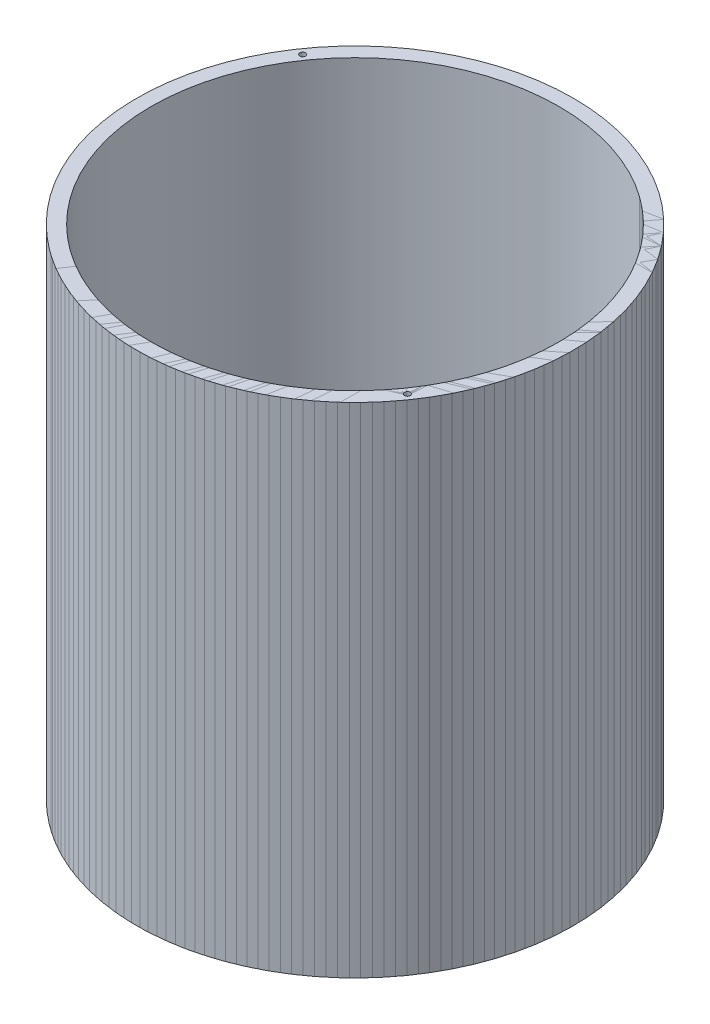
ISO-10303-21;
HEADER;
FILE_DESCRIPTION(('STEP AP214'),'2;1');
FILE_NAME('part.step','',(''),(''),'','','');
FILE_SCHEMA(('AUTOMOTIVE_DESIGN { 1 0 10303 214 1 1 1 1 }'));
ENDSEC;
DATA;
#1=APPLICATION_CONTEXT('core data for automotive mechanical design processes');
#2=APPLICATION_PROTOCOL_DEFINITION('international standard','automotive_design',2000,#1);
#3=PRODUCT_CONTEXT('',#1,'mechanical');
#4=PRODUCT('Part','Part','',(#3));
#5=PRODUCT_RELATED_PRODUCT_CATEGORY('part','',(#4));
#6=PRODUCT_DEFINITION_FORMATION('','',#4);
#7=PRODUCT_DEFINITION_CONTEXT('part definition',#1,'design');
#8=PRODUCT_DEFINITION('design','',#6,#7);
#9=PRODUCT_DEFINITION_SHAPE('','',#8);
#10=(LENGTH_UNIT() NAMED_UNIT(*) SI_UNIT(.MILLI.,.METRE.));
#11=(NAMED_UNIT(*) PLANE_ANGLE_UNIT() SI_UNIT($,.RADIAN.));
#12=(NAMED_UNIT(*) SI_UNIT($,.STERADIAN.) SOLID_ANGLE_UNIT());
#13=UNCERTAINTY_MEASURE_WITH_UNIT(LENGTH_MEASURE(1.E-05),#10,'distance_accuracy_value','');
#14=(GEOMETRIC_REPRESENTATION_CONTEXT(3) GLOBAL_UNCERTAINTY_ASSIGNED_CONTEXT((#13)) GLOBAL_UNIT_ASSIGNED_CONTEXT((#10,
#11,#12)) REPRESENTATION_CONTEXT('',''));
#15=CARTESIAN_POINT('',(0.,0.,0.));
#16=DIRECTION('',(0.,0.,1.));
#17=DIRECTION('',(1.,0.,0.));
#18=AXIS2_PLACEMENT_3D('',#15,#16,#17);
#19=CARTESIAN_POINT('',(193.392189054267,324.789542194984,841.433816930312));
#20=DIRECTION('',(0.,-1.,0.));
#21=DIRECTION('',(0.,0.,-1.));
#22=AXIS2_PLACEMENT_3D('',#19,#20,#21);
#23=CYLINDRICAL_SURFACE('',#22,71.);
#24=DIRECTION('',(0.,-1.,0.));
#25=VECTOR('',#24,1.);
#26=CARTESIAN_POINT('',(234.008163536553,324.789542194984,783.198581747011));
#27=LINE('',#26,#25);
#28=CARTESIAN_POINT('',(234.008163536553,151.289542194984,783.198581747011));
#29=VERTEX_POINT('',#28);
#30=CARTESIAN_POINT('',(234.008163536553,324.789542194984,783.198581747011));
#31=VERTEX_POINT('',#30);
#32=EDGE_CURVE('E83',#29,#31,#27,.F.);
#33=ORIENTED_EDGE('',*,*,#32,.F.);
#34=CARTESIAN_POINT('',(193.392189054267,151.289542194984,841.433816930312));
#35=DIRECTION('',(0.,-1.,0.));
#36=DIRECTION('',(0.,0.,-1.));
#37=AXIS2_PLACEMENT_3D('',#34,#35,#36);
#38=CIRCLE('',#37,71.);
#39=CARTESIAN_POINT('',(152.776214571982,151.289542194984,899.669052113613));
#40=VERTEX_POINT('',#39);
#41=EDGE_CURVE('E93',#29,#40,#38,.T.);
#42=ORIENTED_EDGE('',*,*,#41,.T.);
#43=DIRECTION('',(0.,-1.,0.));
#44=VECTOR('',#43,1.);
#45=CARTESIAN_POINT('',(152.776214571982,324.789542194984,899.669052113613));
#46=LINE('',#45,#44);
#47=CARTESIAN_POINT('',(152.776214571982,324.789542194984,899.669052113613));
#48=VERTEX_POINT('',#47);
#49=EDGE_CURVE('E67',#48,#40,#46,.T.);
#50=ORIENTED_EDGE('',*,*,#49,.F.);
#51=CARTESIAN_POINT('',(193.392189054267,324.789542194984,841.433816930312));
#52=DIRECTION('',(0.,-1.,0.));
#53=DIRECTION('',(0.,0.,-1.));
#54=AXIS2_PLACEMENT_3D('',#51,#52,#53);
#55=CIRCLE('',#54,71.);
#56=EDGE_CURVE('E95',#31,#48,#55,.T.);
#57=ORIENTED_EDGE('',*,*,#56,.F.);
#58=EDGE_LOOP('',(#33,#42,#50,#57));
#59=FACE_BOUND('',#58,.T.);
#60=ADVANCED_FACE('F45',(#59),#23,.F.);
#61=CARTESIAN_POINT('',(193.392189054267,324.789542194984,841.433816930312));
#62=DIRECTION('',(0.,-1.,0.));
#63=DIRECTION('',(0.,0.,-1.));
#64=AXIS2_PLACEMENT_3D('',#61,#62,#63);
#65=CYLINDRICAL_SURFACE('',#64,76.);
#66=CARTESIAN_POINT('',(193.392189054267,151.289542194984,841.433816930312));
#67=DIRECTION('',(0.,-1.,0.));
#68=DIRECTION('',(0.,0.,-1.));
#69=AXIS2_PLACEMENT_3D('',#66,#67,#68);
#70=CIRCLE('',#69,76.);
#71=CARTESIAN_POINT('',(236.868443429672,151.289542194984,779.097508846779));
#72=VERTEX_POINT('',#71);
#73=CARTESIAN_POINT('',(149.915934678864,151.289542194984,903.770125013846));
#74=VERTEX_POINT('',#73);
#75=EDGE_CURVE('E103',#72,#74,#70,.T.);
#76=ORIENTED_EDGE('',*,*,#75,.F.);
#77=DIRECTION('',(0.,-1.,0.));
#78=VECTOR('',#77,1.);
#79=CARTESIAN_POINT('',(236.868443429672,324.789542194984,779.097508846779));
#80=LINE('',#79,#78);
#81=CARTESIAN_POINT('',(236.868443429672,324.789542194984,779.097508846779));
#82=VERTEX_POINT('',#81);
#83=EDGE_CURVE('E59',#72,#82,#80,.F.);
#84=ORIENTED_EDGE('',*,*,#83,.T.);
#85=CARTESIAN_POINT('',(193.392189054267,324.789542194984,841.433816930312));
#86=DIRECTION('',(0.,-1.,0.));
#87=DIRECTION('',(0.,0.,-1.));
#88=AXIS2_PLACEMENT_3D('',#85,#86,#87);
#89=CIRCLE('',#88,76.);
#90=CARTESIAN_POINT('',(149.915934678864,324.789542194984,903.770125013846));
#91=VERTEX_POINT('',#90);
#92=EDGE_CURVE('E89',#82,#91,#89,.T.);
#93=ORIENTED_EDGE('',*,*,#92,.T.);
#94=DIRECTION('',(0.,-1.,0.));
#95=VECTOR('',#94,1.);
#96=CARTESIAN_POINT('',(149.915934678864,324.789542194984,903.770125013846));
#97=LINE('',#96,#95);
#98=EDGE_CURVE('E115',#91,#74,#97,.T.);
#99=ORIENTED_EDGE('',*,*,#98,.T.);
#100=EDGE_LOOP('',(#76,#84,#93,#99));
#101=FACE_BOUND('',#100,.T.);
#102=ADVANCED_FACE('F121',(#101),#65,.T.);
#103=CARTESIAN_POINT('',(0.,324.789542194984,0.));
#104=DIRECTION('',(0.,-1.,0.));
#105=DIRECTION('',(0.,0.,-1.));
#106=AXIS2_PLACEMENT_3D('',#103,#104,#105);
#107=PLANE('',#106);
#108=CARTESIAN_POINT('',(253.677960687685,324.789542194984,883.479931359157));
#109=DIRECTION('',(0.,-1.,0.));
#110=DIRECTION('',(0.,0.,-1.));
#111=AXIS2_PLACEMENT_3D('',#108,#109,#110);
#112=CIRCLE('',#111,0.999999999999998);
#113=CARTESIAN_POINT('',(253.677960687685,324.789542194984,882.479931359157));
#114=VERTEX_POINT('',#113);
#115=EDGE_CURVE('E108',#114,#114,#112,.T.);
#116=ORIENTED_EDGE('',*,*,#115,.T.);
#117=EDGE_LOOP('',(#116));
#118=FACE_BOUND('',#117,.T.);
#119=DIRECTION('',(0.572055978623735,0.,-0.820214580046491));
#120=VECTOR('',#119,1.);
#121=CARTESIAN_POINT('',(524.913002615921,324.789542194984,366.098858406972));
#122=LINE('',#121,#120);
#123=EDGE_CURVE('E100',#91,#48,#122,.T.);
#124=ORIENTED_EDGE('',*,*,#123,.F.);
#125=ORIENTED_EDGE('',*,*,#92,.F.);
#126=EDGE_CURVE('E96',#31,#82,#122,.T.);
#127=ORIENTED_EDGE('',*,*,#126,.F.);
#128=ORIENTED_EDGE('',*,*,#56,.T.);
#129=EDGE_LOOP('',(#124,#125,#127,#128));
#130=FACE_BOUND('',#129,.T.);
#131=ADVANCED_FACE('F122',(#118,#130),#107,.F.);
#132=CARTESIAN_POINT('',(0.,151.289542194984,0.));
#133=DIRECTION('',(0.,-1.,0.));
#134=DIRECTION('',(0.,0.,-1.));
#135=AXIS2_PLACEMENT_3D('',#132,#133,#134);
#136=PLANE('',#135);
#137=CARTESIAN_POINT('',(253.677960687685,151.289542194984,883.479931359157));
#138=DIRECTION('',(0.,-1.,0.));
#139=DIRECTION('',(0.,0.,-1.));
#140=AXIS2_PLACEMENT_3D('',#137,#138,#139);
#141=CIRCLE('',#140,0.999999999999998);
#142=CARTESIAN_POINT('',(253.677960687685,151.289542194984,882.479931359157));
#143=VERTEX_POINT('',#142);
#144=EDGE_CURVE('E99',#143,#143,#141,.T.);
#145=ORIENTED_EDGE('',*,*,#144,.F.);
#146=EDGE_LOOP('',(#145));
#147=FACE_BOUND('',#146,.T.);
#148=ORIENTED_EDGE('',*,*,#75,.T.);
#149=DIRECTION('',(0.572055978623735,0.,-0.820214580046491));
#150=VECTOR('',#149,1.);
#151=CARTESIAN_POINT('',(524.913002615921,151.289542194984,366.098858406972));
#152=LINE('',#151,#150);
#153=EDGE_CURVE('E12',#74,#40,#152,.T.);
#154=ORIENTED_EDGE('',*,*,#153,.T.);
#155=ORIENTED_EDGE('',*,*,#41,.F.);
#156=EDGE_CURVE('E48',#29,#72,#152,.T.);
#157=ORIENTED_EDGE('',*,*,#156,.T.);
#158=EDGE_LOOP('',(#148,#154,#155,#157));
#159=FACE_BOUND('',#158,.T.);
#160=ADVANCED_FACE('F98',(#147,#159),#136,.T.);
#161=CARTESIAN_POINT('',(253.677960687685,324.789542194984,883.479931359157));
#162=DIRECTION('',(0.,-1.,0.));
#163=DIRECTION('',(0.,0.,-1.));
#164=AXIS2_PLACEMENT_3D('',#161,#162,#163);
#165=CYLINDRICAL_SURFACE('',#164,0.999999999999998);
#166=ORIENTED_EDGE('',*,*,#115,.F.);
#167=EDGE_LOOP('',(#166));
#168=FACE_BOUND('',#167,.T.);
#169=ORIENTED_EDGE('',*,*,#144,.T.);
#170=EDGE_LOOP('',(#169));
#171=FACE_BOUND('',#170,.T.);
#172=ADVANCED_FACE('F129',(#168,#171),#165,.F.);
#173=CARTESIAN_POINT('',(524.913002615921,0.,366.098858406972));
#174=DIRECTION('',(-0.820214580046491,0.,-0.572055978623735));
#175=DIRECTION('',(-0.572055978623735,0.,0.820214580046491));
#176=AXIS2_PLACEMENT_3D('',#173,#174,#175);
#177=PLANE('',#176);
#178=ORIENTED_EDGE('',*,*,#126,.T.);
#179=ORIENTED_EDGE('',*,*,#83,.F.);
#180=ORIENTED_EDGE('',*,*,#156,.F.);
#181=ORIENTED_EDGE('',*,*,#32,.T.);
#182=EDGE_LOOP('',(#178,#179,#180,#181));
#183=FACE_BOUND('',#182,.T.);
#184=ADVANCED_FACE('F82',(#183),#177,.T.);
#185=ORIENTED_EDGE('',*,*,#123,.T.);
#186=ORIENTED_EDGE('',*,*,#49,.T.);
#187=ORIENTED_EDGE('',*,*,#153,.F.);
#188=ORIENTED_EDGE('',*,*,#98,.F.);
#189=EDGE_LOOP('',(#185,#186,#187,#188));
#190=FACE_BOUND('',#189,.T.);
#191=ADVANCED_FACE('F123',(#190),#177,.T.);
#192=CLOSED_SHELL('',(#60,#102,#131,#160,#172,#184,#191));
#193=MANIFOLD_SOLID_BREP('B2',#192);
#194=CARTESIAN_POINT('',(253.677960687685,324.789542194984,883.479931359157));
#195=DIRECTION('',(0.,-1.,0.));
#196=DIRECTION('',(0.,0.,-1.));
#197=AXIS2_PLACEMENT_3D('',#194,#195,#196);
#198=CYLINDRICAL_SURFACE('',#197,0.999999999999998);
#199=CARTESIAN_POINT('',(253.677960687685,324.789542194984,883.479931359157));
#200=DIRECTION('',(0.,-1.,0.));
#201=DIRECTION('',(0.,0.,-1.));
#202=AXIS2_PLACEMENT_3D('',#199,#200,#201);
#203=CIRCLE('',#202,0.999999999999998);
#204=CARTESIAN_POINT('',(253.677960687685,324.789542194984,882.479931359157));
#205=VERTEX_POINT('',#204);
#206=EDGE_CURVE('E201',#205,#205,#203,.T.);
#207=ORIENTED_EDGE('',*,*,#206,.F.);
#208=EDGE_LOOP('',(#207));
#209=FACE_BOUND('',#208,.T.);
#210=CARTESIAN_POINT('',(253.677960687685,151.289542194984,883.479931359157));
#211=DIRECTION('',(0.,-1.,0.));
#212=DIRECTION('',(0.,0.,-1.));
#213=AXIS2_PLACEMENT_3D('',#210,#211,#212);
#214=CIRCLE('',#213,0.999999999999998);
#215=CARTESIAN_POINT('',(253.677960687685,151.289542194984,882.479931359157));
#216=VERTEX_POINT('',#215);
#217=EDGE_CURVE('E215',#216,#216,#214,.T.);
#218=ORIENTED_EDGE('',*,*,#217,.T.);
#219=EDGE_LOOP('',(#218));
#220=FACE_BOUND('',#219,.T.);
#221=ADVANCED_FACE('F193',(#209,#220),#198,.F.);
#222=CARTESIAN_POINT('',(133.10641742085,324.789542194984,799.387702501468));
#223=DIRECTION('',(0.,-1.,0.));
#224=DIRECTION('',(0.,0.,-1.));
#225=AXIS2_PLACEMENT_3D('',#222,#223,#224);
#226=CYLINDRICAL_SURFACE('',#225,0.999999999999998);
#227=CARTESIAN_POINT('',(133.10641742085,324.789542194984,799.387702501468));
#228=DIRECTION('',(0.,-1.,0.));
#229=DIRECTION('',(0.,0.,-1.));
#230=AXIS2_PLACEMENT_3D('',#227,#228,#229);
#231=CIRCLE('',#230,0.999999999999998);
#232=CARTESIAN_POINT('',(133.10641742085,324.789542194984,798.387702501468));
#233=VERTEX_POINT('',#232);
#234=EDGE_CURVE('E206',#233,#233,#231,.T.);
#235=ORIENTED_EDGE('',*,*,#234,.F.);
#236=EDGE_LOOP('',(#235));
#237=FACE_BOUND('',#236,.T.);
#238=CARTESIAN_POINT('',(133.10641742085,151.289542194984,799.387702501468));
#239=DIRECTION('',(0.,-1.,0.));
#240=DIRECTION('',(0.,0.,-1.));
#241=AXIS2_PLACEMENT_3D('',#238,#239,#240);
#242=CIRCLE('',#241,0.999999999999998);
#243=CARTESIAN_POINT('',(133.10641742085,151.289542194984,798.387702501468));
#244=VERTEX_POINT('',#243);
#245=EDGE_CURVE('E213',#244,#244,#242,.T.);
#246=ORIENTED_EDGE('',*,*,#245,.T.);
#247=EDGE_LOOP('',(#246));
#248=FACE_BOUND('',#247,.T.);
#249=ADVANCED_FACE('F233',(#237,#248),#226,.F.);
#250=CARTESIAN_POINT('',(193.392189054267,324.789542194984,841.433816930312));
#251=DIRECTION('',(0.,-1.,0.));
#252=DIRECTION('',(0.,0.,-1.));
#253=AXIS2_PLACEMENT_3D('',#250,#251,#252);
#254=CYLINDRICAL_SURFACE('',#253,71.);
#255=CARTESIAN_POINT('',(193.392189054267,324.789542194984,841.433816930312));
#256=DIRECTION('',(0.,-1.,0.));
#257=DIRECTION('',(0.,0.,-1.));
#258=AXIS2_PLACEMENT_3D('',#255,#256,#257);
#259=CIRCLE('',#258,71.);
#260=CARTESIAN_POINT('',(193.392189054267,324.789542194984,770.433816930312));
#261=VERTEX_POINT('',#260);
#262=EDGE_CURVE('E220',#261,#261,#259,.T.);
#263=ORIENTED_EDGE('',*,*,#262,.F.);
#264=EDGE_LOOP('',(#263));
#265=FACE_BOUND('',#264,.T.);
#266=CARTESIAN_POINT('',(193.392189054267,151.289542194984,841.433816930312));
#267=DIRECTION('',(0.,-1.,0.));
#268=DIRECTION('',(0.,0.,-1.));
#269=AXIS2_PLACEMENT_3D('',#266,#267,#268);
#270=CIRCLE('',#269,71.);
#271=CARTESIAN_POINT('',(193.392189054267,151.289542194984,770.433816930312));
#272=VERTEX_POINT('',#271);
#273=EDGE_CURVE('E210',#272,#272,#270,.T.);
#274=ORIENTED_EDGE('',*,*,#273,.T.);
#275=EDGE_LOOP('',(#274));
#276=FACE_BOUND('',#275,.T.);
#277=ADVANCED_FACE('F195',(#265,#276),#254,.F.);
#278=CARTESIAN_POINT('',(193.392189054267,324.789542194984,841.433816930312));
#279=DIRECTION('',(0.,-1.,0.));
#280=DIRECTION('',(0.,0.,-1.));
#281=AXIS2_PLACEMENT_3D('',#278,#279,#280);
#282=CYLINDRICAL_SURFACE('',#281,76.);
#283=CARTESIAN_POINT('',(193.392189054267,324.789542194984,841.433816930312));
#284=DIRECTION('',(0.,-1.,0.));
#285=DIRECTION('',(0.,0.,-1.));
#286=AXIS2_PLACEMENT_3D('',#283,#284,#285);
#287=CIRCLE('',#286,76.);
#288=CARTESIAN_POINT('',(193.392189054267,324.789542194984,765.433816930312));
#289=VERTEX_POINT('',#288);
#290=EDGE_CURVE('E44',#289,#289,#287,.T.);
#291=ORIENTED_EDGE('',*,*,#290,.T.);
#292=EDGE_LOOP('',(#291));
#293=FACE_BOUND('',#292,.T.);
#294=CARTESIAN_POINT('',(193.392189054267,151.289542194984,841.433816930312));
#295=DIRECTION('',(0.,-1.,0.));
#296=DIRECTION('',(0.,0.,-1.));
#297=AXIS2_PLACEMENT_3D('',#294,#295,#296);
#298=CIRCLE('',#297,76.);
#299=CARTESIAN_POINT('',(193.392189054267,151.289542194984,765.433816930312));
#300=VERTEX_POINT('',#299);
#301=EDGE_CURVE('E197',#300,#300,#298,.T.);
#302=ORIENTED_EDGE('',*,*,#301,.F.);
#303=EDGE_LOOP('',(#302));
#304=FACE_BOUND('',#303,.T.);
#305=ADVANCED_FACE('F246',(#293,#304),#282,.T.);
#306=CARTESIAN_POINT('',(0.,324.789542194984,0.));
#307=DIRECTION('',(0.,-1.,0.));
#308=DIRECTION('',(0.,0.,-1.));
#309=AXIS2_PLACEMENT_3D('',#306,#307,#308);
#310=PLANE('',#309);
#311=ORIENTED_EDGE('',*,*,#262,.T.);
#312=EDGE_LOOP('',(#311));
#313=FACE_BOUND('',#312,.T.);
#314=ORIENTED_EDGE('',*,*,#234,.T.);
#315=EDGE_LOOP('',(#314));
#316=FACE_BOUND('',#315,.T.);
#317=ORIENTED_EDGE('',*,*,#206,.T.);
#318=EDGE_LOOP('',(#317));
#319=FACE_BOUND('',#318,.T.);
#320=ORIENTED_EDGE('',*,*,#290,.F.);
#321=EDGE_LOOP('',(#320));
#322=FACE_BOUND('',#321,.T.);
#323=ADVANCED_FACE('F230',(#313,#316,#319,#322),#310,.F.);
#324=CARTESIAN_POINT('',(0.,151.289542194984,0.));
#325=DIRECTION('',(0.,-1.,0.));
#326=DIRECTION('',(0.,0.,-1.));
#327=AXIS2_PLACEMENT_3D('',#324,#325,#326);
#328=PLANE('',#327);
#329=ORIENTED_EDGE('',*,*,#273,.F.);
#330=EDGE_LOOP('',(#329));
#331=FACE_BOUND('',#330,.T.);
#332=ORIENTED_EDGE('',*,*,#245,.F.);
#333=EDGE_LOOP('',(#332));
#334=FACE_BOUND('',#333,.T.);
#335=ORIENTED_EDGE('',*,*,#217,.F.);
#336=EDGE_LOOP('',(#335));
#337=FACE_BOUND('',#336,.T.);
#338=ORIENTED_EDGE('',*,*,#301,.T.);
#339=EDGE_LOOP('',(#338));
#340=FACE_BOUND('',#339,.T.);
#341=ADVANCED_FACE('F238',(#331,#334,#337,#340),#328,.T.);
#342=CLOSED_SHELL('',(#221,#249,#277,#305,#323,#341));
#343=MANIFOLD_SOLID_BREP('B6',#342);
#344=ADVANCED_BREP_SHAPE_REPRESENTATION('',(#18,#193,#343),#14);
#345=SHAPE_DEFINITION_REPRESENTATION(#9,#344);
ENDSEC;
END-ISO-10303-21;
